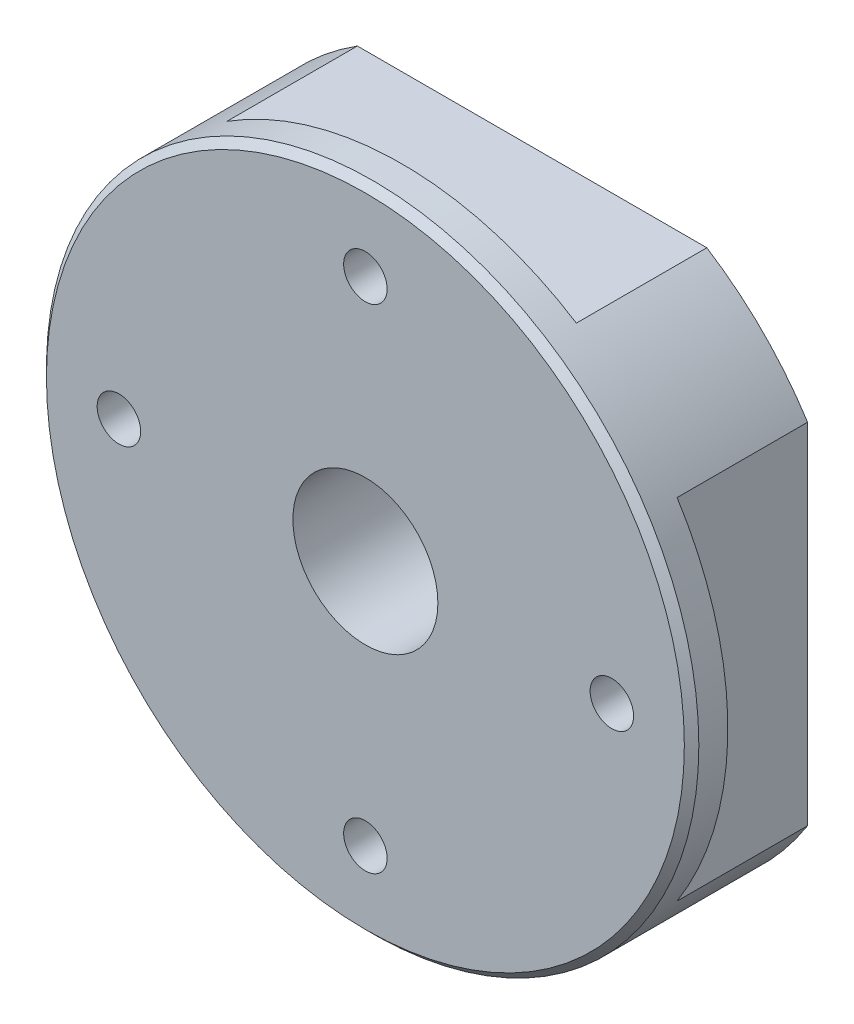
ISO-10303-21;
HEADER;
FILE_DESCRIPTION(('STEP AP214'),'2;1');
FILE_NAME('part.step','',(''),(''),'','','');
FILE_SCHEMA(('AUTOMOTIVE_DESIGN { 1 0 10303 214 1 1 1 1 }'));
ENDSEC;
DATA;
#1=APPLICATION_CONTEXT('core data for automotive mechanical design processes');
#2=APPLICATION_PROTOCOL_DEFINITION('international standard','automotive_design',2000,#1);
#3=PRODUCT_CONTEXT('',#1,'mechanical');
#4=PRODUCT('Part','Part','',(#3));
#5=PRODUCT_RELATED_PRODUCT_CATEGORY('part','',(#4));
#6=PRODUCT_DEFINITION_FORMATION('','',#4);
#7=PRODUCT_DEFINITION_CONTEXT('part definition',#1,'design');
#8=PRODUCT_DEFINITION('design','',#6,#7);
#9=PRODUCT_DEFINITION_SHAPE('','',#8);
#10=(LENGTH_UNIT() NAMED_UNIT(*) SI_UNIT(.MILLI.,.METRE.));
#11=(NAMED_UNIT(*) PLANE_ANGLE_UNIT() SI_UNIT($,.RADIAN.));
#12=(NAMED_UNIT(*) SI_UNIT($,.STERADIAN.) SOLID_ANGLE_UNIT());
#13=UNCERTAINTY_MEASURE_WITH_UNIT(LENGTH_MEASURE(1.E-05),#10,'distance_accuracy_value','');
#14=(GEOMETRIC_REPRESENTATION_CONTEXT(3) GLOBAL_UNCERTAINTY_ASSIGNED_CONTEXT((#13)) GLOBAL_UNIT_ASSIGNED_CONTEXT((#10,
#11,#12)) REPRESENTATION_CONTEXT('',''));
#15=CARTESIAN_POINT('',(0.,0.,0.));
#16=DIRECTION('',(0.,0.,1.));
#17=DIRECTION('',(1.,0.,0.));
#18=AXIS2_PLACEMENT_3D('',#15,#16,#17);
#19=CARTESIAN_POINT('',(0.,0.,0.));
#20=DIRECTION('',(0.,0.,1.));
#21=DIRECTION('',(1.,0.,0.));
#22=AXIS2_PLACEMENT_3D('',#19,#20,#21);
#23=PLANE('',#22);
#24=CARTESIAN_POINT('',(0.,15.5,0.));
#25=DIRECTION('',(0.,0.,-1.));
#26=DIRECTION('',(-1.,0.,0.));
#27=AXIS2_PLACEMENT_3D('',#24,#25,#26);
#28=CIRCLE('',#27,2.025);
#29=CARTESIAN_POINT('',(-2.025,15.5,0.));
#30=VERTEX_POINT('',#29);
#31=EDGE_CURVE('E140',#30,#30,#28,.T.);
#32=ORIENTED_EDGE('',*,*,#31,.F.);
#33=EDGE_LOOP('',(#32));
#34=FACE_BOUND('',#33,.T.);
#35=CARTESIAN_POINT('',(0.,-15.5,0.));
#36=DIRECTION('',(0.,0.,-1.));
#37=DIRECTION('',(-1.,0.,0.));
#38=AXIS2_PLACEMENT_3D('',#35,#36,#37);
#39=CIRCLE('',#38,2.025);
#40=CARTESIAN_POINT('',(-2.025,-15.5,0.));
#41=VERTEX_POINT('',#40);
#42=EDGE_CURVE('E131',#41,#41,#39,.T.);
#43=ORIENTED_EDGE('',*,*,#42,.F.);
#44=EDGE_LOOP('',(#43));
#45=FACE_BOUND('',#44,.T.);
#46=CARTESIAN_POINT('',(0.,0.,0.));
#47=DIRECTION('',(0.,0.,1.));
#48=DIRECTION('',(1.,0.,0.));
#49=AXIS2_PLACEMENT_3D('',#46,#47,#48);
#50=CIRCLE('',#49,5.);
#51=CARTESIAN_POINT('',(5.,0.,0.));
#52=VERTEX_POINT('',#51);
#53=EDGE_CURVE('E184',#52,#52,#50,.T.);
#54=ORIENTED_EDGE('',*,*,#53,.T.);
#55=EDGE_LOOP('',(#54));
#56=FACE_BOUND('',#55,.T.);
#57=DIRECTION('',(0.,1.,0.));
#58=VECTOR('',#57,1.);
#59=CARTESIAN_POINT('',(-19.,-19.,0.));
#60=LINE('',#59,#58);
#61=CARTESIAN_POINT('',(-19.,-12.051970793194,0.));
#62=VERTEX_POINT('',#61);
#63=CARTESIAN_POINT('',(-19.,12.051970793194,0.));
#64=VERTEX_POINT('',#63);
#65=EDGE_CURVE('E74',#62,#64,#60,.T.);
#66=ORIENTED_EDGE('',*,*,#65,.T.);
#67=CARTESIAN_POINT('',(0.,0.,0.));
#68=DIRECTION('',(0.,0.,1.));
#69=DIRECTION('',(1.,0.,0.));
#70=AXIS2_PLACEMENT_3D('',#67,#68,#69);
#71=CIRCLE('',#70,22.5);
#72=CARTESIAN_POINT('',(-12.051970793194,19.,0.));
#73=VERTEX_POINT('',#72);
#74=EDGE_CURVE('E225',#73,#64,#71,.T.);
#75=ORIENTED_EDGE('',*,*,#74,.F.);
#76=DIRECTION('',(1.,0.,0.));
#77=VECTOR('',#76,1.);
#78=CARTESIAN_POINT('',(19.,19.,0.));
#79=LINE('',#78,#77);
#80=CARTESIAN_POINT('',(12.051970793194,19.,0.));
#81=VERTEX_POINT('',#80);
#82=EDGE_CURVE('E170',#73,#81,#79,.T.);
#83=ORIENTED_EDGE('',*,*,#82,.T.);
#84=CARTESIAN_POINT('',(19.,12.0519707931939,0.));
#85=VERTEX_POINT('',#84);
#86=EDGE_CURVE('E220',#85,#81,#71,.T.);
#87=ORIENTED_EDGE('',*,*,#86,.F.);
#88=DIRECTION('',(0.,-1.,0.));
#89=VECTOR('',#88,1.);
#90=CARTESIAN_POINT('',(19.,-19.,0.));
#91=LINE('',#90,#89);
#92=CARTESIAN_POINT('',(19.,-12.0519707931939,0.));
#93=VERTEX_POINT('',#92);
#94=EDGE_CURVE('E174',#85,#93,#91,.T.);
#95=ORIENTED_EDGE('',*,*,#94,.T.);
#96=CARTESIAN_POINT('',(12.0519707931939,-19.,0.));
#97=VERTEX_POINT('',#96);
#98=EDGE_CURVE('E216',#97,#93,#71,.T.);
#99=ORIENTED_EDGE('',*,*,#98,.F.);
#100=DIRECTION('',(-1.,0.,0.));
#101=VECTOR('',#100,1.);
#102=CARTESIAN_POINT('',(19.,-19.,0.));
#103=LINE('',#102,#101);
#104=CARTESIAN_POINT('',(-12.051970793194,-19.,0.));
#105=VERTEX_POINT('',#104);
#106=EDGE_CURVE('E67',#97,#105,#103,.T.);
#107=ORIENTED_EDGE('',*,*,#106,.T.);
#108=EDGE_CURVE('E281',#62,#105,#71,.T.);
#109=ORIENTED_EDGE('',*,*,#108,.F.);
#110=EDGE_LOOP('',(#66,#75,#83,#87,#95,#99,#107,#109));
#111=FACE_BOUND('',#110,.T.);
#112=ADVANCED_FACE('F50',(#34,#45,#56,#111),#23,.F.);
#113=CARTESIAN_POINT('',(0.,0.,11.5));
#114=DIRECTION('',(0.,0.,-1.));
#115=DIRECTION('',(-1.,0.,0.));
#116=AXIS2_PLACEMENT_3D('',#113,#114,#115);
#117=CYLINDRICAL_SURFACE('',#116,22.5);
#118=CARTESIAN_POINT('',(0.,0.,11.));
#119=DIRECTION('',(0.,0.,1.));
#120=DIRECTION('',(1.,0.,0.));
#121=AXIS2_PLACEMENT_3D('',#118,#119,#120);
#122=CIRCLE('',#121,22.5);
#123=CARTESIAN_POINT('',(22.5,0.,11.));
#124=VERTEX_POINT('',#123);
#125=EDGE_CURVE('E229',#124,#124,#122,.F.);
#126=ORIENTED_EDGE('',*,*,#125,.T.);
#127=EDGE_LOOP('',(#126));
#128=FACE_BOUND('',#127,.T.);
#129=DIRECTION('',(0.,0.,-1.));
#130=VECTOR('',#129,1.);
#131=CARTESIAN_POINT('',(-19.,12.051970793194,11.5));
#132=LINE('',#131,#130);
#133=CARTESIAN_POINT('',(-19.,12.051970793194,9.));
#134=VERTEX_POINT('',#133);
#135=EDGE_CURVE('E12',#134,#64,#132,.T.);
#136=ORIENTED_EDGE('',*,*,#135,.F.);
#137=CARTESIAN_POINT('',(0.,0.,9.));
#138=DIRECTION('',(0.,0.,-1.));
#139=DIRECTION('',(-1.,0.,0.));
#140=AXIS2_PLACEMENT_3D('',#137,#138,#139);
#141=CIRCLE('',#140,22.5);
#142=CARTESIAN_POINT('',(-19.,-12.051970793194,9.));
#143=VERTEX_POINT('',#142);
#144=EDGE_CURVE('E60',#143,#134,#141,.T.);
#145=ORIENTED_EDGE('',*,*,#144,.F.);
#146=DIRECTION('',(0.,0.,-1.));
#147=VECTOR('',#146,1.);
#148=CARTESIAN_POINT('',(-19.,-12.051970793194,11.5));
#149=LINE('',#148,#147);
#150=EDGE_CURVE('E255',#62,#143,#149,.F.);
#151=ORIENTED_EDGE('',*,*,#150,.F.);
#152=ORIENTED_EDGE('',*,*,#108,.T.);
#153=DIRECTION('',(0.,0.,-1.));
#154=VECTOR('',#153,1.);
#155=CARTESIAN_POINT('',(-12.0519707931939,-19.,11.5));
#156=LINE('',#155,#154);
#157=CARTESIAN_POINT('',(-12.051970793194,-19.,9.));
#158=VERTEX_POINT('',#157);
#159=EDGE_CURVE('E253',#158,#105,#156,.T.);
#160=ORIENTED_EDGE('',*,*,#159,.F.);
#161=CARTESIAN_POINT('',(12.0519707931939,-19.,9.));
#162=VERTEX_POINT('',#161);
#163=EDGE_CURVE('E252',#162,#158,#141,.T.);
#164=ORIENTED_EDGE('',*,*,#163,.F.);
#165=DIRECTION('',(0.,0.,-1.));
#166=VECTOR('',#165,1.);
#167=CARTESIAN_POINT('',(12.0519707931939,-19.,11.5));
#168=LINE('',#167,#166);
#169=EDGE_CURVE('E249',#97,#162,#168,.F.);
#170=ORIENTED_EDGE('',*,*,#169,.F.);
#171=ORIENTED_EDGE('',*,*,#98,.T.);
#172=DIRECTION('',(0.,0.,-1.));
#173=VECTOR('',#172,1.);
#174=CARTESIAN_POINT('',(19.,-12.0519707931939,11.5));
#175=LINE('',#174,#173);
#176=CARTESIAN_POINT('',(19.,-12.0519707931939,9.));
#177=VERTEX_POINT('',#176);
#178=EDGE_CURVE('E246',#177,#93,#175,.T.);
#179=ORIENTED_EDGE('',*,*,#178,.F.);
#180=CARTESIAN_POINT('',(19.,12.051970793194,9.));
#181=VERTEX_POINT('',#180);
#182=EDGE_CURVE('E240',#181,#177,#141,.T.);
#183=ORIENTED_EDGE('',*,*,#182,.F.);
#184=DIRECTION('',(0.,0.,-1.));
#185=VECTOR('',#184,1.);
#186=CARTESIAN_POINT('',(19.,12.0519707931939,11.5));
#187=LINE('',#186,#185);
#188=EDGE_CURVE('E243',#85,#181,#187,.F.);
#189=ORIENTED_EDGE('',*,*,#188,.F.);
#190=ORIENTED_EDGE('',*,*,#86,.T.);
#191=DIRECTION('',(0.,0.,-1.));
#192=VECTOR('',#191,1.);
#193=CARTESIAN_POINT('',(12.051970793194,19.,11.5));
#194=LINE('',#193,#192);
#195=CARTESIAN_POINT('',(12.051970793194,19.,9.));
#196=VERTEX_POINT('',#195);
#197=EDGE_CURVE('E239',#196,#81,#194,.T.);
#198=ORIENTED_EDGE('',*,*,#197,.F.);
#199=CARTESIAN_POINT('',(-12.051970793194,19.,9.));
#200=VERTEX_POINT('',#199);
#201=EDGE_CURVE('E236',#200,#196,#141,.T.);
#202=ORIENTED_EDGE('',*,*,#201,.F.);
#203=DIRECTION('',(0.,0.,-1.));
#204=VECTOR('',#203,1.);
#205=CARTESIAN_POINT('',(-12.051970793194,19.,11.5));
#206=LINE('',#205,#204);
#207=EDGE_CURVE('E233',#73,#200,#206,.F.);
#208=ORIENTED_EDGE('',*,*,#207,.F.);
#209=ORIENTED_EDGE('',*,*,#74,.T.);
#210=EDGE_LOOP('',(#136,#145,#151,#152,#160,#164,#170,#171,#179,#183,#189,#190,#198,#202,#208,#209));
#211=FACE_BOUND('',#210,.T.);
#212=ADVANCED_FACE('F277',(#128,#211),#117,.T.);
#213=CARTESIAN_POINT('',(0.,0.,11.5));
#214=DIRECTION('',(0.,0.,1.));
#215=DIRECTION('',(1.,0.,0.));
#216=AXIS2_PLACEMENT_3D('',#213,#214,#215);
#217=PLANE('',#216);
#218=CARTESIAN_POINT('',(0.,0.,11.5));
#219=DIRECTION('',(0.,0.,1.));
#220=DIRECTION('',(1.,0.,0.));
#221=AXIS2_PLACEMENT_3D('',#218,#219,#220);
#222=CIRCLE('',#221,22.);
#223=CARTESIAN_POINT('',(22.,0.,11.5));
#224=VERTEX_POINT('',#223);
#225=EDGE_CURVE('E224',#224,#224,#222,.T.);
#226=ORIENTED_EDGE('',*,*,#225,.T.);
#227=EDGE_LOOP('',(#226));
#228=FACE_BOUND('',#227,.T.);
#229=CARTESIAN_POINT('',(0.,17.,11.5));
#230=DIRECTION('',(0.,0.,1.));
#231=DIRECTION('',(1.,0.,0.));
#232=AXIS2_PLACEMENT_3D('',#229,#230,#231);
#233=CIRCLE('',#232,1.5);
#234=CARTESIAN_POINT('',(1.5,17.,11.5));
#235=VERTEX_POINT('',#234);
#236=EDGE_CURVE('E185',#235,#235,#233,.T.);
#237=ORIENTED_EDGE('',*,*,#236,.F.);
#238=EDGE_LOOP('',(#237));
#239=FACE_BOUND('',#238,.T.);
#240=CARTESIAN_POINT('',(-16.9999999999997,-3.2925028435302E-13,11.5));
#241=DIRECTION('',(0.,0.,1.));
#242=DIRECTION('',(1.,0.,0.));
#243=AXIS2_PLACEMENT_3D('',#240,#241,#242);
#244=CIRCLE('',#243,1.50000000000057);
#245=CARTESIAN_POINT('',(-15.4999999999992,-3.2925028435302E-13,11.5));
#246=VERTEX_POINT('',#245);
#247=EDGE_CURVE('E189',#246,#246,#244,.T.);
#248=ORIENTED_EDGE('',*,*,#247,.F.);
#249=EDGE_LOOP('',(#248));
#250=FACE_BOUND('',#249,.T.);
#251=CARTESIAN_POINT('',(17.0000000000003,2.68882138776405E-13,11.5));
#252=DIRECTION('',(0.,0.,1.));
#253=DIRECTION('',(1.,0.,0.));
#254=AXIS2_PLACEMENT_3D('',#251,#252,#253);
#255=CIRCLE('',#254,1.5);
#256=CARTESIAN_POINT('',(18.5000000000003,2.68882138776405E-13,11.5));
#257=VERTEX_POINT('',#256);
#258=EDGE_CURVE('E197',#257,#257,#255,.T.);
#259=ORIENTED_EDGE('',*,*,#258,.F.);
#260=EDGE_LOOP('',(#259));
#261=FACE_BOUND('',#260,.T.);
#262=CARTESIAN_POINT('',(6.07930604096499E-13,-17.0000000000001,11.5));
#263=DIRECTION('',(0.,0.,1.));
#264=DIRECTION('',(1.,0.,0.));
#265=AXIS2_PLACEMENT_3D('',#262,#263,#264);
#266=CIRCLE('',#265,1.50000000000034);
#267=CARTESIAN_POINT('',(1.50000000000095,-17.0000000000001,11.5));
#268=VERTEX_POINT('',#267);
#269=EDGE_CURVE('E205',#268,#268,#266,.T.);
#270=ORIENTED_EDGE('',*,*,#269,.F.);
#271=EDGE_LOOP('',(#270));
#272=FACE_BOUND('',#271,.T.);
#273=CARTESIAN_POINT('',(0.,0.,11.5));
#274=DIRECTION('',(0.,0.,1.));
#275=DIRECTION('',(1.,0.,0.));
#276=AXIS2_PLACEMENT_3D('',#273,#274,#275);
#277=CIRCLE('',#276,5.);
#278=CARTESIAN_POINT('',(5.,0.,11.5));
#279=VERTEX_POINT('',#278);
#280=EDGE_CURVE('E212',#279,#279,#277,.T.);
#281=ORIENTED_EDGE('',*,*,#280,.F.);
#282=EDGE_LOOP('',(#281));
#283=FACE_BOUND('',#282,.T.);
#284=ADVANCED_FACE('F322',(#228,#239,#250,#261,#272,#283),#217,.T.);
#285=CARTESIAN_POINT('',(0.,0.,11.5));
#286=DIRECTION('',(0.,0.,-1.));
#287=DIRECTION('',(-1.,0.,0.));
#288=AXIS2_PLACEMENT_3D('',#285,#286,#287);
#289=CYLINDRICAL_SURFACE('',#288,5.);
#290=ORIENTED_EDGE('',*,*,#280,.T.);
#291=EDGE_LOOP('',(#290));
#292=FACE_BOUND('',#291,.T.);
#293=ORIENTED_EDGE('',*,*,#53,.F.);
#294=EDGE_LOOP('',(#293));
#295=FACE_BOUND('',#294,.T.);
#296=ADVANCED_FACE('F329',(#292,#295),#289,.F.);
#297=CARTESIAN_POINT('',(6.07930604096499E-13,-17.0000000000001,6.));
#298=DIRECTION('',(0.,0.,1.));
#299=DIRECTION('',(1.,0.,0.));
#300=AXIS2_PLACEMENT_3D('',#297,#298,#299);
#301=CYLINDRICAL_SURFACE('',#300,1.50000000000034);
#302=CARTESIAN_POINT('',(6.07930604096499E-13,-17.0000000000001,6.));
#303=DIRECTION('',(0.,0.,1.));
#304=DIRECTION('',(1.,0.,0.));
#305=AXIS2_PLACEMENT_3D('',#302,#303,#304);
#306=CIRCLE('',#305,1.50000000000034);
#307=CARTESIAN_POINT('',(1.50000000000095,-17.0000000000001,6.));
#308=VERTEX_POINT('',#307);
#309=EDGE_CURVE('E167',#308,#308,#306,.T.);
#310=ORIENTED_EDGE('',*,*,#309,.F.);
#311=EDGE_LOOP('',(#310));
#312=FACE_BOUND('',#311,.T.);
#313=ORIENTED_EDGE('',*,*,#269,.T.);
#314=EDGE_LOOP('',(#313));
#315=FACE_BOUND('',#314,.T.);
#316=ADVANCED_FACE('F333',(#312,#315),#301,.F.);
#317=CARTESIAN_POINT('',(6.07930604096499E-13,-17.0000000000001,6.));
#318=DIRECTION('',(0.,0.,1.));
#319=DIRECTION('',(1.,0.,0.));
#320=AXIS2_PLACEMENT_3D('',#317,#318,#319);
#321=PLANE('',#320);
#322=ORIENTED_EDGE('',*,*,#309,.T.);
#323=EDGE_LOOP('',(#322));
#324=FACE_BOUND('',#323,.T.);
#325=ADVANCED_FACE('F335',(#324),#321,.T.);
#326=CARTESIAN_POINT('',(17.0000000000003,2.68882138776405E-13,6.));
#327=DIRECTION('',(0.,0.,1.));
#328=DIRECTION('',(1.,0.,0.));
#329=AXIS2_PLACEMENT_3D('',#326,#327,#328);
#330=CYLINDRICAL_SURFACE('',#329,1.5);
#331=CARTESIAN_POINT('',(17.0000000000003,2.68882138776405E-13,6.));
#332=DIRECTION('',(0.,0.,1.));
#333=DIRECTION('',(1.,0.,0.));
#334=AXIS2_PLACEMENT_3D('',#331,#332,#333);
#335=CIRCLE('',#334,1.5);
#336=CARTESIAN_POINT('',(18.5000000000003,2.68882138776405E-13,6.));
#337=VERTEX_POINT('',#336);
#338=EDGE_CURVE('E201',#337,#337,#335,.T.);
#339=ORIENTED_EDGE('',*,*,#338,.F.);
#340=EDGE_LOOP('',(#339));
#341=FACE_BOUND('',#340,.T.);
#342=ORIENTED_EDGE('',*,*,#258,.T.);
#343=EDGE_LOOP('',(#342));
#344=FACE_BOUND('',#343,.T.);
#345=ADVANCED_FACE('F338',(#341,#344),#330,.F.);
#346=CARTESIAN_POINT('',(17.0000000000003,2.68882138776405E-13,6.));
#347=DIRECTION('',(0.,0.,1.));
#348=DIRECTION('',(1.,0.,0.));
#349=AXIS2_PLACEMENT_3D('',#346,#347,#348);
#350=PLANE('',#349);
#351=ORIENTED_EDGE('',*,*,#338,.T.);
#352=EDGE_LOOP('',(#351));
#353=FACE_BOUND('',#352,.T.);
#354=ADVANCED_FACE('F343',(#353),#350,.T.);
#355=CARTESIAN_POINT('',(-16.9999999999997,-3.2925028435302E-13,6.));
#356=DIRECTION('',(0.,0.,1.));
#357=DIRECTION('',(1.,0.,0.));
#358=AXIS2_PLACEMENT_3D('',#355,#356,#357);
#359=CYLINDRICAL_SURFACE('',#358,1.50000000000057);
#360=CARTESIAN_POINT('',(-16.9999999999997,-3.2925028435302E-13,6.));
#361=DIRECTION('',(0.,0.,1.));
#362=DIRECTION('',(1.,0.,0.));
#363=AXIS2_PLACEMENT_3D('',#360,#361,#362);
#364=CIRCLE('',#363,1.50000000000057);
#365=CARTESIAN_POINT('',(-15.4999999999992,-3.2925028435302E-13,6.));
#366=VERTEX_POINT('',#365);
#367=EDGE_CURVE('E193',#366,#366,#364,.T.);
#368=ORIENTED_EDGE('',*,*,#367,.F.);
#369=EDGE_LOOP('',(#368));
#370=FACE_BOUND('',#369,.T.);
#371=ORIENTED_EDGE('',*,*,#247,.T.);
#372=EDGE_LOOP('',(#371));
#373=FACE_BOUND('',#372,.T.);
#374=ADVANCED_FACE('F346',(#370,#373),#359,.F.);
#375=CARTESIAN_POINT('',(-16.9999999999997,-3.2925028435302E-13,6.));
#376=DIRECTION('',(0.,0.,1.));
#377=DIRECTION('',(1.,0.,0.));
#378=AXIS2_PLACEMENT_3D('',#375,#376,#377);
#379=PLANE('',#378);
#380=ORIENTED_EDGE('',*,*,#367,.T.);
#381=EDGE_LOOP('',(#380));
#382=FACE_BOUND('',#381,.T.);
#383=ADVANCED_FACE('F351',(#382),#379,.T.);
#384=CARTESIAN_POINT('',(0.,17.,6.));
#385=DIRECTION('',(0.,0.,1.));
#386=DIRECTION('',(1.,0.,0.));
#387=AXIS2_PLACEMENT_3D('',#384,#385,#386);
#388=CYLINDRICAL_SURFACE('',#387,1.5);
#389=CARTESIAN_POINT('',(0.,17.,6.));
#390=DIRECTION('',(0.,0.,1.));
#391=DIRECTION('',(1.,0.,0.));
#392=AXIS2_PLACEMENT_3D('',#389,#390,#391);
#393=CIRCLE('',#392,1.5);
#394=CARTESIAN_POINT('',(1.5,17.,6.));
#395=VERTEX_POINT('',#394);
#396=EDGE_CURVE('E180',#395,#395,#393,.T.);
#397=ORIENTED_EDGE('',*,*,#396,.F.);
#398=EDGE_LOOP('',(#397));
#399=FACE_BOUND('',#398,.T.);
#400=ORIENTED_EDGE('',*,*,#236,.T.);
#401=EDGE_LOOP('',(#400));
#402=FACE_BOUND('',#401,.T.);
#403=ADVANCED_FACE('F354',(#399,#402),#388,.F.);
#404=CARTESIAN_POINT('',(0.,17.,6.));
#405=DIRECTION('',(0.,0.,1.));
#406=DIRECTION('',(1.,0.,0.));
#407=AXIS2_PLACEMENT_3D('',#404,#405,#406);
#408=PLANE('',#407);
#409=ORIENTED_EDGE('',*,*,#396,.T.);
#410=EDGE_LOOP('',(#409));
#411=FACE_BOUND('',#410,.T.);
#412=ADVANCED_FACE('F360',(#411),#408,.T.);
#413=CARTESIAN_POINT('',(0.,0.,11.5));
#414=DIRECTION('',(0.,0.,-1.));
#415=DIRECTION('',(-1.,0.,0.));
#416=AXIS2_PLACEMENT_3D('',#413,#414,#415);
#417=CONICAL_SURFACE('',#416,22.,0.785398163397448);
#418=ORIENTED_EDGE('',*,*,#125,.F.);
#419=EDGE_LOOP('',(#418));
#420=FACE_BOUND('',#419,.T.);
#421=ORIENTED_EDGE('',*,*,#225,.F.);
#422=EDGE_LOOP('',(#421));
#423=FACE_BOUND('',#422,.T.);
#424=ADVANCED_FACE('F53',(#420,#423),#417,.T.);
#425=CARTESIAN_POINT('',(19.,19.,9.));
#426=DIRECTION('',(0.,1.,0.));
#427=DIRECTION('',(0.,0.,1.));
#428=AXIS2_PLACEMENT_3D('',#425,#426,#427);
#429=PLANE('',#428);
#430=ORIENTED_EDGE('',*,*,#197,.T.);
#431=ORIENTED_EDGE('',*,*,#82,.F.);
#432=ORIENTED_EDGE('',*,*,#207,.T.);
#433=DIRECTION('',(1.,0.,0.));
#434=VECTOR('',#433,1.);
#435=CARTESIAN_POINT('',(19.,19.,9.));
#436=LINE('',#435,#434);
#437=EDGE_CURVE('E155',#200,#196,#436,.T.);
#438=ORIENTED_EDGE('',*,*,#437,.T.);
#439=EDGE_LOOP('',(#430,#431,#432,#438));
#440=FACE_BOUND('',#439,.T.);
#441=ADVANCED_FACE('F294',(#440),#429,.T.);
#442=CARTESIAN_POINT('',(0.,0.,9.));
#443=DIRECTION('',(0.,0.,-1.));
#444=DIRECTION('',(-1.,0.,0.));
#445=AXIS2_PLACEMENT_3D('',#442,#443,#444);
#446=PLANE('',#445);
#447=ORIENTED_EDGE('',*,*,#201,.T.);
#448=ORIENTED_EDGE('',*,*,#437,.F.);
#449=EDGE_LOOP('',(#447,#448));
#450=FACE_BOUND('',#449,.T.);
#451=ADVANCED_FACE('F297',(#450),#446,.T.);
#452=CARTESIAN_POINT('',(19.,-19.,9.));
#453=DIRECTION('',(1.,0.,0.));
#454=DIRECTION('',(0.,0.,-1.));
#455=AXIS2_PLACEMENT_3D('',#452,#453,#454);
#456=PLANE('',#455);
#457=ORIENTED_EDGE('',*,*,#178,.T.);
#458=ORIENTED_EDGE('',*,*,#94,.F.);
#459=ORIENTED_EDGE('',*,*,#188,.T.);
#460=DIRECTION('',(0.,-1.,0.));
#461=VECTOR('',#460,1.);
#462=CARTESIAN_POINT('',(19.,-19.,9.));
#463=LINE('',#462,#461);
#464=EDGE_CURVE('E159',#181,#177,#463,.T.);
#465=ORIENTED_EDGE('',*,*,#464,.T.);
#466=EDGE_LOOP('',(#457,#458,#459,#465));
#467=FACE_BOUND('',#466,.T.);
#468=ADVANCED_FACE('F274',(#467),#456,.T.);
#469=ORIENTED_EDGE('',*,*,#182,.T.);
#470=ORIENTED_EDGE('',*,*,#464,.F.);
#471=EDGE_LOOP('',(#469,#470));
#472=FACE_BOUND('',#471,.T.);
#473=ADVANCED_FACE('F269',(#472),#446,.T.);
#474=CARTESIAN_POINT('',(19.,-19.,9.));
#475=DIRECTION('',(0.,-1.,0.));
#476=DIRECTION('',(0.,0.,-1.));
#477=AXIS2_PLACEMENT_3D('',#474,#475,#476);
#478=PLANE('',#477);
#479=ORIENTED_EDGE('',*,*,#159,.T.);
#480=ORIENTED_EDGE('',*,*,#106,.F.);
#481=ORIENTED_EDGE('',*,*,#169,.T.);
#482=DIRECTION('',(-1.,0.,0.));
#483=VECTOR('',#482,1.);
#484=CARTESIAN_POINT('',(19.,-19.,9.));
#485=LINE('',#484,#483);
#486=EDGE_CURVE('E163',#162,#158,#485,.T.);
#487=ORIENTED_EDGE('',*,*,#486,.T.);
#488=EDGE_LOOP('',(#479,#480,#481,#487));
#489=FACE_BOUND('',#488,.T.);
#490=ADVANCED_FACE('F310',(#489),#478,.T.);
#491=ORIENTED_EDGE('',*,*,#163,.T.);
#492=ORIENTED_EDGE('',*,*,#486,.F.);
#493=EDGE_LOOP('',(#491,#492));
#494=FACE_BOUND('',#493,.T.);
#495=ADVANCED_FACE('F311',(#494),#446,.T.);
#496=ORIENTED_EDGE('',*,*,#144,.T.);
#497=DIRECTION('',(0.,1.,0.));
#498=VECTOR('',#497,1.);
#499=CARTESIAN_POINT('',(-19.,-19.,9.));
#500=LINE('',#499,#498);
#501=EDGE_CURVE('E151',#143,#134,#500,.T.);
#502=ORIENTED_EDGE('',*,*,#501,.F.);
#503=EDGE_LOOP('',(#496,#502));
#504=FACE_BOUND('',#503,.T.);
#505=ADVANCED_FACE('F300',(#504),#446,.T.);
#506=CARTESIAN_POINT('',(-19.,-19.,9.));
#507=DIRECTION('',(-1.,0.,0.));
#508=DIRECTION('',(0.,0.,1.));
#509=AXIS2_PLACEMENT_3D('',#506,#507,#508);
#510=PLANE('',#509);
#511=ORIENTED_EDGE('',*,*,#135,.T.);
#512=ORIENTED_EDGE('',*,*,#65,.F.);
#513=ORIENTED_EDGE('',*,*,#150,.T.);
#514=ORIENTED_EDGE('',*,*,#501,.T.);
#515=EDGE_LOOP('',(#511,#512,#513,#514));
#516=FACE_BOUND('',#515,.T.);
#517=ADVANCED_FACE('F313',(#516),#510,.T.);
#518=CARTESIAN_POINT('',(0.,-15.5,3.));
#519=DIRECTION('',(0.,0.,-1.));
#520=DIRECTION('',(-1.,0.,0.));
#521=AXIS2_PLACEMENT_3D('',#518,#519,#520);
#522=CONICAL_SURFACE('',#521,1.65,1.02974425867665);
#523=CARTESIAN_POINT('',(0.,-15.5,3.99142002139547));
#524=VERTEX_POINT('',#523);
#525=VERTEX_LOOP('',#524);
#526=FACE_BOUND('',#525,.T.);
#527=CARTESIAN_POINT('',(0.,-15.5,3.));
#528=DIRECTION('',(0.,0.,-1.));
#529=DIRECTION('',(-1.,0.,0.));
#530=AXIS2_PLACEMENT_3D('',#527,#528,#529);
#531=CIRCLE('',#530,1.65);
#532=CARTESIAN_POINT('',(-1.65,-15.5,3.));
#533=VERTEX_POINT('',#532);
#534=EDGE_CURVE('E147',#533,#533,#531,.T.);
#535=ORIENTED_EDGE('',*,*,#534,.T.);
#536=EDGE_LOOP('',(#535));
#537=FACE_BOUND('',#536,.T.);
#538=ADVANCED_FACE('F452',(#526,#537),#522,.F.);
#539=CARTESIAN_POINT('',(0.,-15.5,0.));
#540=DIRECTION('',(0.,0.,-1.));
#541=DIRECTION('',(-1.,0.,0.));
#542=AXIS2_PLACEMENT_3D('',#539,#540,#541);
#543=CYLINDRICAL_SURFACE('',#542,1.65);
#544=ORIENTED_EDGE('',*,*,#534,.F.);
#545=EDGE_LOOP('',(#544));
#546=FACE_BOUND('',#545,.T.);
#547=CARTESIAN_POINT('',(0.,-15.5,0.375));
#548=DIRECTION('',(0.,0.,-1.));
#549=DIRECTION('',(-1.,0.,0.));
#550=AXIS2_PLACEMENT_3D('',#547,#548,#549);
#551=CIRCLE('',#550,1.65);
#552=CARTESIAN_POINT('',(-1.65,-15.5,0.375));
#553=VERTEX_POINT('',#552);
#554=EDGE_CURVE('E137',#553,#553,#551,.T.);
#555=ORIENTED_EDGE('',*,*,#554,.T.);
#556=EDGE_LOOP('',(#555));
#557=FACE_BOUND('',#556,.T.);
#558=ADVANCED_FACE('F459',(#546,#557),#543,.F.);
#559=CARTESIAN_POINT('',(0.,-15.5,0.));
#560=DIRECTION('',(0.,0.,-1.));
#561=DIRECTION('',(-1.,0.,0.));
#562=AXIS2_PLACEMENT_3D('',#559,#560,#561);
#563=CONICAL_SURFACE('',#562,2.025,0.785398163397445);
#564=ORIENTED_EDGE('',*,*,#554,.F.);
#565=EDGE_LOOP('',(#564));
#566=FACE_BOUND('',#565,.T.);
#567=ORIENTED_EDGE('',*,*,#42,.T.);
#568=EDGE_LOOP('',(#567));
#569=FACE_BOUND('',#568,.T.);
#570=ADVANCED_FACE('F124',(#566,#569),#563,.F.);
#571=CARTESIAN_POINT('',(0.,15.5,3.));
#572=DIRECTION('',(0.,0.,-1.));
#573=DIRECTION('',(-1.,0.,0.));
#574=AXIS2_PLACEMENT_3D('',#571,#572,#573);
#575=CONICAL_SURFACE('',#574,1.65,1.02974425867665);
#576=CARTESIAN_POINT('',(0.,15.5,3.99142002139547));
#577=VERTEX_POINT('',#576);
#578=VERTEX_LOOP('',#577);
#579=FACE_BOUND('',#578,.T.);
#580=CARTESIAN_POINT('',(0.,15.5,3.));
#581=DIRECTION('',(0.,0.,-1.));
#582=DIRECTION('',(-1.,0.,0.));
#583=AXIS2_PLACEMENT_3D('',#580,#581,#582);
#584=CIRCLE('',#583,1.65);
#585=CARTESIAN_POINT('',(-1.65,15.5,3.));
#586=VERTEX_POINT('',#585);
#587=EDGE_CURVE('E128',#586,#586,#584,.T.);
#588=ORIENTED_EDGE('',*,*,#587,.T.);
#589=EDGE_LOOP('',(#588));
#590=FACE_BOUND('',#589,.T.);
#591=ADVANCED_FACE('F120',(#579,#590),#575,.F.);
#592=CARTESIAN_POINT('',(0.,15.5,0.));
#593=DIRECTION('',(0.,0.,-1.));
#594=DIRECTION('',(-1.,0.,0.));
#595=AXIS2_PLACEMENT_3D('',#592,#593,#594);
#596=CYLINDRICAL_SURFACE('',#595,1.65);
#597=ORIENTED_EDGE('',*,*,#587,.F.);
#598=EDGE_LOOP('',(#597));
#599=FACE_BOUND('',#598,.T.);
#600=CARTESIAN_POINT('',(0.,15.5,0.375));
#601=DIRECTION('',(0.,0.,-1.));
#602=DIRECTION('',(-1.,0.,0.));
#603=AXIS2_PLACEMENT_3D('',#600,#601,#602);
#604=CIRCLE('',#603,1.65);
#605=CARTESIAN_POINT('',(-1.65,15.5,0.375));
#606=VERTEX_POINT('',#605);
#607=EDGE_CURVE('E132',#606,#606,#604,.T.);
#608=ORIENTED_EDGE('',*,*,#607,.T.);
#609=EDGE_LOOP('',(#608));
#610=FACE_BOUND('',#609,.T.);
#611=ADVANCED_FACE('F123',(#599,#610),#596,.F.);
#612=CARTESIAN_POINT('',(0.,15.5,0.));
#613=DIRECTION('',(0.,0.,-1.));
#614=DIRECTION('',(-1.,0.,0.));
#615=AXIS2_PLACEMENT_3D('',#612,#613,#614);
#616=CONICAL_SURFACE('',#615,2.025,0.785398163397445);
#617=ORIENTED_EDGE('',*,*,#607,.F.);
#618=EDGE_LOOP('',(#617));
#619=FACE_BOUND('',#618,.T.);
#620=ORIENTED_EDGE('',*,*,#31,.T.);
#621=EDGE_LOOP('',(#620));
#622=FACE_BOUND('',#621,.T.);
#623=ADVANCED_FACE('F495',(#619,#622),#616,.F.);
#624=CLOSED_SHELL('',(#112,#212,#284,#296,#316,#325,#345,#354,#374,#383,#403,#412,#424,#441,
#451,#468,#473,#490,#495,#505,#517,#538,#558,#570,#591,#611,#623));
#625=MANIFOLD_SOLID_BREP('B2',#624);
#626=ADVANCED_BREP_SHAPE_REPRESENTATION('',(#18,#625),#14);
#627=SHAPE_DEFINITION_REPRESENTATION(#9,#626);
ENDSEC;
END-ISO-10303-21;
